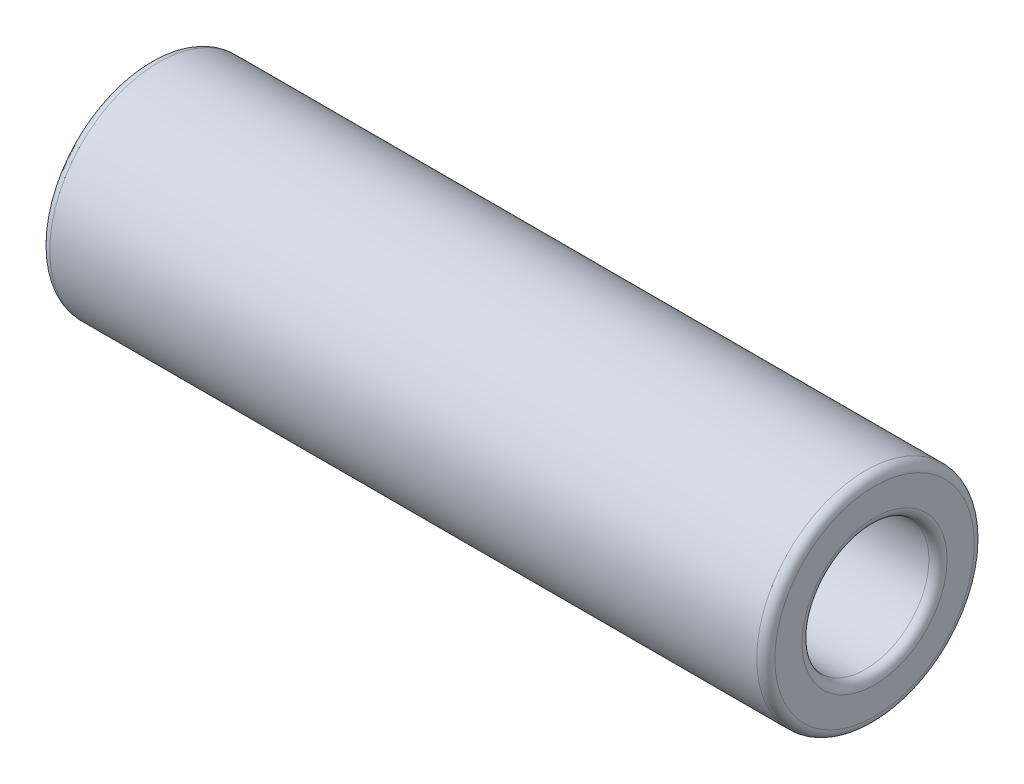
ISO-10303-21;
HEADER;
FILE_DESCRIPTION(('STEP AP214'),'2;1');
FILE_NAME('part.step','',(''),(''),'','','');
FILE_SCHEMA(('AUTOMOTIVE_DESIGN { 1 0 10303 214 1 1 1 1 }'));
ENDSEC;
DATA;
#1=APPLICATION_CONTEXT('core data for automotive mechanical design processes');
#2=APPLICATION_PROTOCOL_DEFINITION('international standard','automotive_design',2000,#1);
#3=PRODUCT_CONTEXT('',#1,'mechanical');
#4=PRODUCT('Part','Part','',(#3));
#5=PRODUCT_RELATED_PRODUCT_CATEGORY('part','',(#4));
#6=PRODUCT_DEFINITION_FORMATION('','',#4);
#7=PRODUCT_DEFINITION_CONTEXT('part definition',#1,'design');
#8=PRODUCT_DEFINITION('design','',#6,#7);
#9=PRODUCT_DEFINITION_SHAPE('','',#8);
#10=(LENGTH_UNIT() NAMED_UNIT(*) SI_UNIT(.MILLI.,.METRE.));
#11=(NAMED_UNIT(*) PLANE_ANGLE_UNIT() SI_UNIT($,.RADIAN.));
#12=(NAMED_UNIT(*) SI_UNIT($,.STERADIAN.) SOLID_ANGLE_UNIT());
#13=UNCERTAINTY_MEASURE_WITH_UNIT(LENGTH_MEASURE(1.E-05),#10,'distance_accuracy_value','');
#14=(GEOMETRIC_REPRESENTATION_CONTEXT(3) GLOBAL_UNCERTAINTY_ASSIGNED_CONTEXT((#13)) GLOBAL_UNIT_ASSIGNED_CONTEXT((#10,
#11,#12)) REPRESENTATION_CONTEXT('',''));
#15=CARTESIAN_POINT('',(0.,0.,0.));
#16=DIRECTION('',(0.,0.,1.));
#17=DIRECTION('',(1.,0.,0.));
#18=AXIS2_PLACEMENT_3D('',#15,#16,#17);
#19=CARTESIAN_POINT('',(40.,0.,0.));
#20=DIRECTION('',(1.,0.,0.));
#21=DIRECTION('',(0.,0.,-1.));
#22=AXIS2_PLACEMENT_3D('',#19,#20,#21);
#23=PLANE('',#22);
#24=CARTESIAN_POINT('',(40.,0.,0.));
#25=DIRECTION('',(1.,0.,0.));
#26=DIRECTION('',(0.,0.,-1.));
#27=AXIS2_PLACEMENT_3D('',#24,#25,#26);
#28=CIRCLE('',#27,4.);
#29=CARTESIAN_POINT('',(40.,0.,-4.));
#30=VERTEX_POINT('',#29);
#31=EDGE_CURVE('E60',#30,#30,#28,.F.);
#32=ORIENTED_EDGE('',*,*,#31,.T.);
#33=EDGE_LOOP('',(#32));
#34=FACE_BOUND('',#33,.T.);
#35=CARTESIAN_POINT('',(40.,0.,0.));
#36=DIRECTION('',(1.,0.,0.));
#37=DIRECTION('',(0.,0.,-1.));
#38=AXIS2_PLACEMENT_3D('',#35,#36,#37);
#39=CIRCLE('',#38,5.5);
#40=CARTESIAN_POINT('',(40.,0.,-5.5));
#41=VERTEX_POINT('',#40);
#42=EDGE_CURVE('E64',#41,#41,#39,.T.);
#43=ORIENTED_EDGE('',*,*,#42,.T.);
#44=EDGE_LOOP('',(#43));
#45=FACE_BOUND('',#44,.T.);
#46=ADVANCED_FACE('F36',(#34,#45),#23,.T.);
#47=CARTESIAN_POINT('',(0.,0.,0.));
#48=DIRECTION('',(1.,0.,0.));
#49=DIRECTION('',(0.,0.,-1.));
#50=AXIS2_PLACEMENT_3D('',#47,#48,#49);
#51=PLANE('',#50);
#52=CARTESIAN_POINT('',(0.,0.,0.));
#53=DIRECTION('',(1.,0.,0.));
#54=DIRECTION('',(0.,0.,-1.));
#55=AXIS2_PLACEMENT_3D('',#52,#53,#54);
#56=CIRCLE('',#55,4.);
#57=CARTESIAN_POINT('',(0.,0.,-4.));
#58=VERTEX_POINT('',#57);
#59=EDGE_CURVE('E10',#58,#58,#56,.T.);
#60=ORIENTED_EDGE('',*,*,#59,.T.);
#61=EDGE_LOOP('',(#60));
#62=FACE_BOUND('',#61,.T.);
#63=CARTESIAN_POINT('',(0.,0.,0.));
#64=DIRECTION('',(1.,0.,0.));
#65=DIRECTION('',(0.,0.,-1.));
#66=AXIS2_PLACEMENT_3D('',#63,#64,#65);
#67=CIRCLE('',#66,5.5);
#68=CARTESIAN_POINT('',(0.,0.,-5.5));
#69=VERTEX_POINT('',#68);
#70=EDGE_CURVE('E44',#69,#69,#67,.F.);
#71=ORIENTED_EDGE('',*,*,#70,.T.);
#72=EDGE_LOOP('',(#71));
#73=FACE_BOUND('',#72,.T.);
#74=ADVANCED_FACE('F92',(#62,#73),#51,.F.);
#75=CARTESIAN_POINT('',(40.,0.,0.));
#76=DIRECTION('',(-1.,0.,0.));
#77=DIRECTION('',(0.,0.,1.));
#78=AXIS2_PLACEMENT_3D('',#75,#76,#77);
#79=CYLINDRICAL_SURFACE('',#78,6.);
#80=CARTESIAN_POINT('',(39.5,0.,0.));
#81=DIRECTION('',(1.,0.,0.));
#82=DIRECTION('',(0.,0.,-1.));
#83=AXIS2_PLACEMENT_3D('',#80,#81,#82);
#84=CIRCLE('',#83,6.);
#85=CARTESIAN_POINT('',(39.5,0.,-6.));
#86=VERTEX_POINT('',#85);
#87=EDGE_CURVE('E49',#86,#86,#84,.F.);
#88=ORIENTED_EDGE('',*,*,#87,.T.);
#89=EDGE_LOOP('',(#88));
#90=FACE_BOUND('',#89,.T.);
#91=CARTESIAN_POINT('',(0.5,0.,0.));
#92=DIRECTION('',(1.,0.,0.));
#93=DIRECTION('',(0.,0.,-1.));
#94=AXIS2_PLACEMENT_3D('',#91,#92,#93);
#95=CIRCLE('',#94,6.);
#96=CARTESIAN_POINT('',(0.5,0.,-6.));
#97=VERTEX_POINT('',#96);
#98=EDGE_CURVE('E54',#97,#97,#95,.T.);
#99=ORIENTED_EDGE('',*,*,#98,.T.);
#100=EDGE_LOOP('',(#99));
#101=FACE_BOUND('',#100,.T.);
#102=ADVANCED_FACE('F98',(#90,#101),#79,.T.);
#103=CARTESIAN_POINT('',(40.,0.,0.));
#104=DIRECTION('',(-1.,0.,0.));
#105=DIRECTION('',(0.,0.,1.));
#106=AXIS2_PLACEMENT_3D('',#103,#104,#105);
#107=CYLINDRICAL_SURFACE('',#106,3.5);
#108=CARTESIAN_POINT('',(39.5,0.,0.));
#109=DIRECTION('',(1.,0.,0.));
#110=DIRECTION('',(0.,0.,-1.));
#111=AXIS2_PLACEMENT_3D('',#108,#109,#110);
#112=CIRCLE('',#111,3.5);
#113=CARTESIAN_POINT('',(39.5,0.,-3.5));
#114=VERTEX_POINT('',#113);
#115=EDGE_CURVE('E68',#114,#114,#112,.T.);
#116=ORIENTED_EDGE('',*,*,#115,.T.);
#117=EDGE_LOOP('',(#116));
#118=FACE_BOUND('',#117,.T.);
#119=CARTESIAN_POINT('',(0.5,0.,0.));
#120=DIRECTION('',(1.,0.,0.));
#121=DIRECTION('',(0.,0.,-1.));
#122=AXIS2_PLACEMENT_3D('',#119,#120,#121);
#123=CIRCLE('',#122,3.5);
#124=CARTESIAN_POINT('',(0.5,0.,-3.5));
#125=VERTEX_POINT('',#124);
#126=EDGE_CURVE('E72',#125,#125,#123,.F.);
#127=ORIENTED_EDGE('',*,*,#126,.T.);
#128=EDGE_LOOP('',(#127));
#129=FACE_BOUND('',#128,.T.);
#130=ADVANCED_FACE('F77',(#118,#129),#107,.F.);
#131=CARTESIAN_POINT('',(39.5,0.,0.));
#132=DIRECTION('',(1.,0.,0.));
#133=DIRECTION('',(0.,0.,-1.));
#134=AXIS2_PLACEMENT_3D('',#131,#132,#133);
#135=TOROIDAL_SURFACE('',#134,4.,0.5);
#136=ORIENTED_EDGE('',*,*,#31,.F.);
#137=EDGE_LOOP('',(#136));
#138=FACE_BOUND('',#137,.T.);
#139=ORIENTED_EDGE('',*,*,#115,.F.);
#140=EDGE_LOOP('',(#139));
#141=FACE_BOUND('',#140,.T.);
#142=ADVANCED_FACE('F88',(#138,#141),#135,.T.);
#143=CARTESIAN_POINT('',(39.5,0.,0.));
#144=DIRECTION('',(1.,0.,0.));
#145=DIRECTION('',(0.,0.,-1.));
#146=AXIS2_PLACEMENT_3D('',#143,#144,#145);
#147=TOROIDAL_SURFACE('',#146,5.5,0.5);
#148=ORIENTED_EDGE('',*,*,#87,.F.);
#149=EDGE_LOOP('',(#148));
#150=FACE_BOUND('',#149,.T.);
#151=ORIENTED_EDGE('',*,*,#42,.F.);
#152=EDGE_LOOP('',(#151));
#153=FACE_BOUND('',#152,.T.);
#154=ADVANCED_FACE('F82',(#150,#153),#147,.T.);
#155=CARTESIAN_POINT('',(0.5,0.,0.));
#156=DIRECTION('',(1.,0.,0.));
#157=DIRECTION('',(0.,0.,-1.));
#158=AXIS2_PLACEMENT_3D('',#155,#156,#157);
#159=TOROIDAL_SURFACE('',#158,4.,0.5);
#160=ORIENTED_EDGE('',*,*,#126,.F.);
#161=EDGE_LOOP('',(#160));
#162=FACE_BOUND('',#161,.T.);
#163=ORIENTED_EDGE('',*,*,#59,.F.);
#164=EDGE_LOOP('',(#163));
#165=FACE_BOUND('',#164,.T.);
#166=ADVANCED_FACE('F79',(#162,#165),#159,.T.);
#167=CARTESIAN_POINT('',(0.5,0.,0.));
#168=DIRECTION('',(1.,0.,0.));
#169=DIRECTION('',(0.,0.,-1.));
#170=AXIS2_PLACEMENT_3D('',#167,#168,#169);
#171=TOROIDAL_SURFACE('',#170,5.5,0.5);
#172=ORIENTED_EDGE('',*,*,#70,.F.);
#173=EDGE_LOOP('',(#172));
#174=FACE_BOUND('',#173,.T.);
#175=ORIENTED_EDGE('',*,*,#98,.F.);
#176=EDGE_LOOP('',(#175));
#177=FACE_BOUND('',#176,.T.);
#178=ADVANCED_FACE('F38',(#174,#177),#171,.T.);
#179=CLOSED_SHELL('',(#46,#74,#102,#130,#142,#154,#166,#178));
#180=MANIFOLD_SOLID_BREP('B2',#179);
#181=ADVANCED_BREP_SHAPE_REPRESENTATION('',(#18,#180),#14);
#182=SHAPE_DEFINITION_REPRESENTATION(#9,#181);
ENDSEC;
END-ISO-10303-21;
